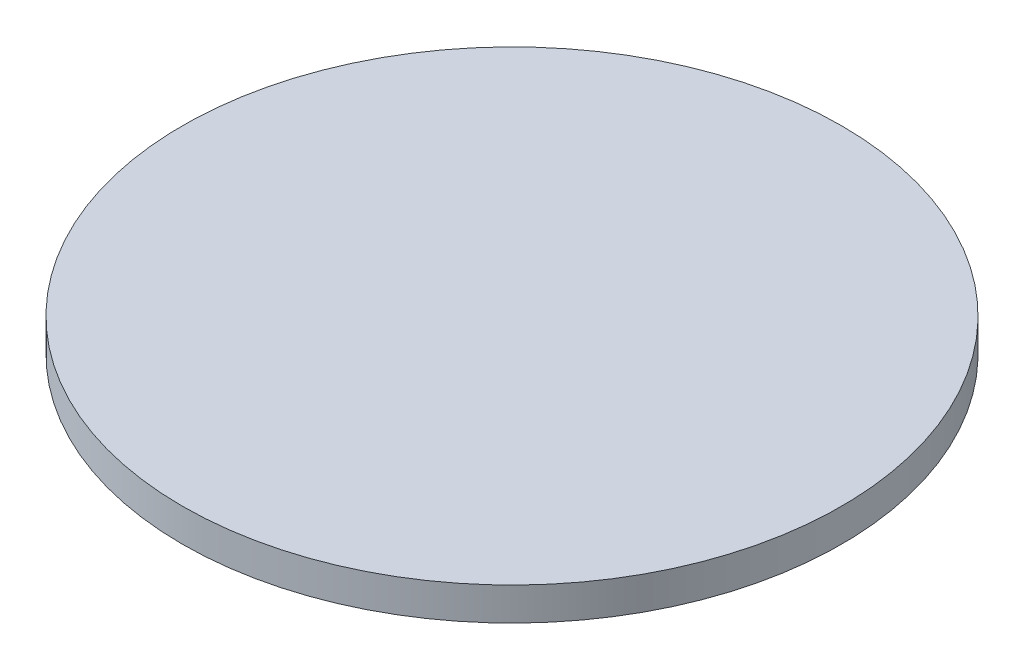
ISO-10303-21;
HEADER;
FILE_DESCRIPTION(('STEP AP214'),'2;1');
FILE_NAME('part.step','',(''),(''),'','','');
FILE_SCHEMA(('AUTOMOTIVE_DESIGN { 1 0 10303 214 1 1 1 1 }'));
ENDSEC;
DATA;
#1=APPLICATION_CONTEXT('core data for automotive mechanical design processes');
#2=APPLICATION_PROTOCOL_DEFINITION('international standard','automotive_design',2000,#1);
#3=PRODUCT_CONTEXT('',#1,'mechanical');
#4=PRODUCT('Part','Part','',(#3));
#5=PRODUCT_RELATED_PRODUCT_CATEGORY('part','',(#4));
#6=PRODUCT_DEFINITION_FORMATION('','',#4);
#7=PRODUCT_DEFINITION_CONTEXT('part definition',#1,'design');
#8=PRODUCT_DEFINITION('design','',#6,#7);
#9=PRODUCT_DEFINITION_SHAPE('','',#8);
#10=(LENGTH_UNIT() NAMED_UNIT(*) SI_UNIT(.MILLI.,.METRE.));
#11=(NAMED_UNIT(*) PLANE_ANGLE_UNIT() SI_UNIT($,.RADIAN.));
#12=(NAMED_UNIT(*) SI_UNIT($,.STERADIAN.) SOLID_ANGLE_UNIT());
#13=UNCERTAINTY_MEASURE_WITH_UNIT(LENGTH_MEASURE(1.E-05),#10,'distance_accuracy_value','');
#14=(GEOMETRIC_REPRESENTATION_CONTEXT(3) GLOBAL_UNCERTAINTY_ASSIGNED_CONTEXT((#13)) GLOBAL_UNIT_ASSIGNED_CONTEXT((#10,
#11,#12)) REPRESENTATION_CONTEXT('',''));
#15=CARTESIAN_POINT('',(0.,0.,0.));
#16=DIRECTION('',(0.,0.,1.));
#17=DIRECTION('',(1.,0.,0.));
#18=AXIS2_PLACEMENT_3D('',#15,#16,#17);
#19=CARTESIAN_POINT('',(0.,2.,0.));
#20=DIRECTION('',(0.,-1.,0.));
#21=DIRECTION('',(0.,0.,-1.));
#22=AXIS2_PLACEMENT_3D('',#19,#20,#21);
#23=CYLINDRICAL_SURFACE('',#22,20.);
#24=CARTESIAN_POINT('',(0.,2.,0.));
#25=DIRECTION('',(0.,1.,0.));
#26=DIRECTION('',(0.,0.,1.));
#27=AXIS2_PLACEMENT_3D('',#24,#25,#26);
#28=CIRCLE('',#27,20.);
#29=CARTESIAN_POINT('',(0.,2.,20.));
#30=VERTEX_POINT('',#29);
#31=EDGE_CURVE('E10',#30,#30,#28,.T.);
#32=ORIENTED_EDGE('',*,*,#31,.F.);
#33=EDGE_LOOP('',(#32));
#34=FACE_BOUND('',#33,.T.);
#35=CARTESIAN_POINT('',(0.,0.,0.));
#36=DIRECTION('',(0.,1.,0.));
#37=DIRECTION('',(0.,0.,1.));
#38=AXIS2_PLACEMENT_3D('',#35,#36,#37);
#39=CIRCLE('',#38,20.);
#40=CARTESIAN_POINT('',(0.,0.,20.));
#41=VERTEX_POINT('',#40);
#42=EDGE_CURVE('E36',#41,#41,#39,.T.);
#43=ORIENTED_EDGE('',*,*,#42,.T.);
#44=EDGE_LOOP('',(#43));
#45=FACE_BOUND('',#44,.T.);
#46=ADVANCED_FACE('F33',(#34,#45),#23,.T.);
#47=CARTESIAN_POINT('',(0.,2.,0.));
#48=DIRECTION('',(0.,1.,0.));
#49=DIRECTION('',(0.,0.,1.));
#50=AXIS2_PLACEMENT_3D('',#47,#48,#49);
#51=PLANE('',#50);
#52=ORIENTED_EDGE('',*,*,#31,.T.);
#53=EDGE_LOOP('',(#52));
#54=FACE_BOUND('',#53,.T.);
#55=ADVANCED_FACE('F48',(#54),#51,.T.);
#56=CARTESIAN_POINT('',(0.,0.,0.));
#57=DIRECTION('',(0.,1.,0.));
#58=DIRECTION('',(0.,0.,1.));
#59=AXIS2_PLACEMENT_3D('',#56,#57,#58);
#60=PLANE('',#59);
#61=ORIENTED_EDGE('',*,*,#42,.F.);
#62=EDGE_LOOP('',(#61));
#63=FACE_BOUND('',#62,.T.);
#64=ADVANCED_FACE('F46',(#63),#60,.F.);
#65=CLOSED_SHELL('',(#46,#55,#64));
#66=MANIFOLD_SOLID_BREP('B2',#65);
#67=ADVANCED_BREP_SHAPE_REPRESENTATION('',(#18,#66),#14);
#68=SHAPE_DEFINITION_REPRESENTATION(#9,#67);
ENDSEC;
END-ISO-10303-21;
